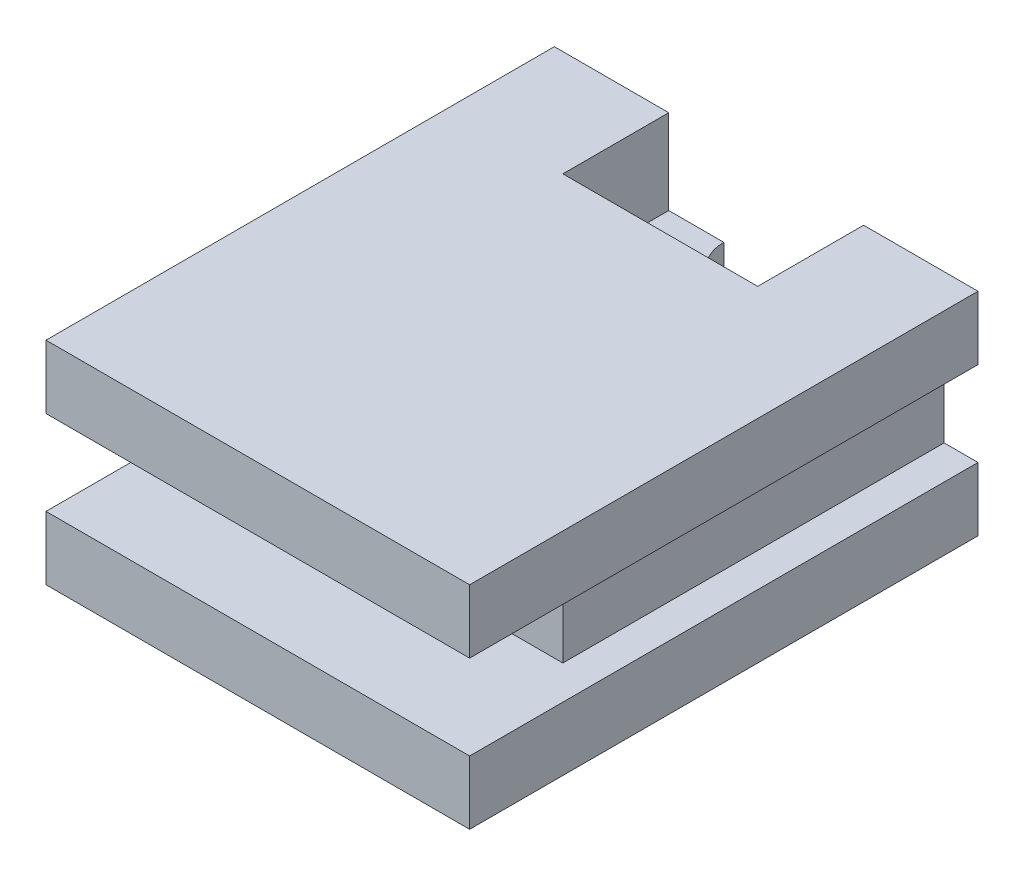
ISO-10303-21;
HEADER;
FILE_DESCRIPTION(('STEP AP214'),'2;1');
FILE_NAME('part.step','',(''),(''),'','','');
FILE_SCHEMA(('AUTOMOTIVE_DESIGN { 1 0 10303 214 1 1 1 1 }'));
ENDSEC;
DATA;
#1=APPLICATION_CONTEXT('core data for automotive mechanical design processes');
#2=APPLICATION_PROTOCOL_DEFINITION('international standard','automotive_design',2000,#1);
#3=PRODUCT_CONTEXT('',#1,'mechanical');
#4=PRODUCT('Part','Part','',(#3));
#5=PRODUCT_RELATED_PRODUCT_CATEGORY('part','',(#4));
#6=PRODUCT_DEFINITION_FORMATION('','',#4);
#7=PRODUCT_DEFINITION_CONTEXT('part definition',#1,'design');
#8=PRODUCT_DEFINITION('design','',#6,#7);
#9=PRODUCT_DEFINITION_SHAPE('','',#8);
#10=(LENGTH_UNIT() NAMED_UNIT(*) SI_UNIT(.MILLI.,.METRE.));
#11=(NAMED_UNIT(*) PLANE_ANGLE_UNIT() SI_UNIT($,.RADIAN.));
#12=(NAMED_UNIT(*) SI_UNIT($,.STERADIAN.) SOLID_ANGLE_UNIT());
#13=UNCERTAINTY_MEASURE_WITH_UNIT(LENGTH_MEASURE(1.E-05),#10,'distance_accuracy_value','');
#14=(GEOMETRIC_REPRESENTATION_CONTEXT(3) GLOBAL_UNCERTAINTY_ASSIGNED_CONTEXT((#13)) GLOBAL_UNIT_ASSIGNED_CONTEXT((#10,
#11,#12)) REPRESENTATION_CONTEXT('',''));
#15=CARTESIAN_POINT('',(0.,0.,0.));
#16=DIRECTION('',(0.,0.,1.));
#17=DIRECTION('',(1.,0.,0.));
#18=AXIS2_PLACEMENT_3D('',#15,#16,#17);
#19=CARTESIAN_POINT('',(0.,0.,0.));
#20=DIRECTION('',(0.,0.,1.));
#21=DIRECTION('',(1.,0.,0.));
#22=AXIS2_PLACEMENT_3D('',#19,#20,#21);
#23=PLANE('',#22);
#24=DIRECTION('',(1.,0.,0.));
#25=VECTOR('',#24,1.);
#26=CARTESIAN_POINT('',(0.,2.5,0.));
#27=LINE('',#26,#25);
#28=CARTESIAN_POINT('',(5.,2.5,0.));
#29=VERTEX_POINT('',#28);
#30=CARTESIAN_POINT('',(11.5,2.5,0.));
#31=VERTEX_POINT('',#30);
#32=EDGE_CURVE('E49',#29,#31,#27,.T.);
#33=ORIENTED_EDGE('',*,*,#32,.T.);
#34=DIRECTION('',(0.,1.,0.));
#35=VECTOR('',#34,1.);
#36=CARTESIAN_POINT('',(11.5,0.,0.));
#37=LINE('',#36,#35);
#38=CARTESIAN_POINT('',(11.5,12.5,0.));
#39=VERTEX_POINT('',#38);
#40=EDGE_CURVE('E193',#31,#39,#37,.T.);
#41=ORIENTED_EDGE('',*,*,#40,.T.);
#42=DIRECTION('',(1.,0.,0.));
#43=VECTOR('',#42,1.);
#44=CARTESIAN_POINT('',(0.,12.5,0.));
#45=LINE('',#44,#43);
#46=CARTESIAN_POINT('',(25.,12.5,0.));
#47=VERTEX_POINT('',#46);
#48=EDGE_CURVE('E260',#39,#47,#45,.T.);
#49=ORIENTED_EDGE('',*,*,#48,.T.);
#50=DIRECTION('',(0.,1.,0.));
#51=VECTOR('',#50,1.);
#52=CARTESIAN_POINT('',(25.,0.,0.));
#53=LINE('',#52,#51);
#54=CARTESIAN_POINT('',(25.,5.,0.));
#55=VERTEX_POINT('',#54);
#56=EDGE_CURVE('E248',#55,#47,#53,.T.);
#57=ORIENTED_EDGE('',*,*,#56,.F.);
#58=DIRECTION('',(1.,0.,0.));
#59=VECTOR('',#58,1.);
#60=CARTESIAN_POINT('',(0.,5.00000000000002,0.));
#61=LINE('',#60,#59);
#62=CARTESIAN_POINT('',(21.,5.,0.));
#63=VERTEX_POINT('',#62);
#64=EDGE_CURVE('E254',#63,#55,#61,.T.);
#65=ORIENTED_EDGE('',*,*,#64,.F.);
#66=DIRECTION('',(0.,1.,0.));
#67=VECTOR('',#66,1.);
#68=CARTESIAN_POINT('',(21.,0.,0.));
#69=LINE('',#68,#67);
#70=CARTESIAN_POINT('',(21.,-5.,0.));
#71=VERTEX_POINT('',#70);
#72=EDGE_CURVE('E251',#71,#63,#69,.T.);
#73=ORIENTED_EDGE('',*,*,#72,.F.);
#74=DIRECTION('',(1.,0.,0.));
#75=VECTOR('',#74,1.);
#76=CARTESIAN_POINT('',(0.,-4.99999999999998,0.));
#77=LINE('',#76,#75);
#78=CARTESIAN_POINT('',(25.,-5.,0.));
#79=VERTEX_POINT('',#78);
#80=EDGE_CURVE('E247',#71,#79,#77,.T.);
#81=ORIENTED_EDGE('',*,*,#80,.T.);
#82=CARTESIAN_POINT('',(25.,-12.5,0.));
#83=VERTEX_POINT('',#82);
#84=EDGE_CURVE('E244',#83,#79,#53,.T.);
#85=ORIENTED_EDGE('',*,*,#84,.F.);
#86=DIRECTION('',(1.,0.,0.));
#87=VECTOR('',#86,1.);
#88=CARTESIAN_POINT('',(0.,-12.5,0.));
#89=LINE('',#88,#87);
#90=CARTESIAN_POINT('',(5.,-12.5,0.));
#91=VERTEX_POINT('',#90);
#92=EDGE_CURVE('E240',#91,#83,#89,.T.);
#93=ORIENTED_EDGE('',*,*,#92,.F.);
#94=DIRECTION('',(0.,1.,0.));
#95=VECTOR('',#94,1.);
#96=CARTESIAN_POINT('',(5.,-12.5,0.));
#97=LINE('',#96,#95);
#98=EDGE_CURVE('E288',#91,#29,#97,.T.);
#99=ORIENTED_EDGE('',*,*,#98,.T.);
#100=EDGE_LOOP('',(#33,#41,#49,#57,#65,#73,#81,#85,#93,#99));
#101=FACE_BOUND('',#100,.T.);
#102=ADVANCED_FACE('F34',(#101),#23,.F.);
#103=CARTESIAN_POINT('',(0.,0.,60.));
#104=DIRECTION('',(0.,0.,1.));
#105=DIRECTION('',(1.,0.,0.));
#106=AXIS2_PLACEMENT_3D('',#103,#104,#105);
#107=PLANE('',#106);
#108=DIRECTION('',(0.,1.,0.));
#109=VECTOR('',#108,1.);
#110=CARTESIAN_POINT('',(25.,0.,60.));
#111=LINE('',#110,#109);
#112=CARTESIAN_POINT('',(25.,-12.5,60.));
#113=VERTEX_POINT('',#112);
#114=CARTESIAN_POINT('',(25.,-5.,60.));
#115=VERTEX_POINT('',#114);
#116=EDGE_CURVE('E222',#113,#115,#111,.T.);
#117=ORIENTED_EDGE('',*,*,#116,.T.);
#118=DIRECTION('',(-1.,0.,0.));
#119=VECTOR('',#118,1.);
#120=CARTESIAN_POINT('',(0.,-4.99999999999999,60.));
#121=LINE('',#120,#119);
#122=CARTESIAN_POINT('',(-25.,-5.,60.));
#123=VERTEX_POINT('',#122);
#124=EDGE_CURVE('E213',#115,#123,#121,.T.);
#125=ORIENTED_EDGE('',*,*,#124,.T.);
#126=DIRECTION('',(0.,1.,0.));
#127=VECTOR('',#126,1.);
#128=CARTESIAN_POINT('',(-25.,0.,60.));
#129=LINE('',#128,#127);
#130=CARTESIAN_POINT('',(-25.,-12.5,60.));
#131=VERTEX_POINT('',#130);
#132=EDGE_CURVE('E216',#131,#123,#129,.T.);
#133=ORIENTED_EDGE('',*,*,#132,.F.);
#134=DIRECTION('',(1.,0.,0.));
#135=VECTOR('',#134,1.);
#136=CARTESIAN_POINT('',(0.,-12.5,60.));
#137=LINE('',#136,#135);
#138=EDGE_CURVE('E219',#131,#113,#137,.T.);
#139=ORIENTED_EDGE('',*,*,#138,.T.);
#140=EDGE_LOOP('',(#117,#125,#133,#139));
#141=FACE_BOUND('',#140,.T.);
#142=ADVANCED_FACE('F304',(#141),#107,.T.);
#143=CARTESIAN_POINT('',(-21.,0.,60.));
#144=DIRECTION('',(-1.,0.,0.));
#145=DIRECTION('',(0.,-1.,0.));
#146=AXIS2_PLACEMENT_3D('',#143,#144,#145);
#147=PLANE('',#146);
#148=DIRECTION('',(0.,-1.,0.));
#149=VECTOR('',#148,1.);
#150=CARTESIAN_POINT('',(-21.,-4.99999999999999,45.));
#151=LINE('',#150,#149);
#152=CARTESIAN_POINT('',(-21.,5.,45.));
#153=VERTEX_POINT('',#152);
#154=CARTESIAN_POINT('',(-21.,-4.99999999999999,45.));
#155=VERTEX_POINT('',#154);
#156=EDGE_CURVE('E199',#153,#155,#151,.T.);
#157=ORIENTED_EDGE('',*,*,#156,.F.);
#158=DIRECTION('',(0.,0.,-1.));
#159=VECTOR('',#158,1.);
#160=CARTESIAN_POINT('',(-21.,5.,60.));
#161=LINE('',#160,#159);
#162=CARTESIAN_POINT('',(-21.,5.,0.));
#163=VERTEX_POINT('',#162);
#164=EDGE_CURVE('E285',#153,#163,#161,.T.);
#165=ORIENTED_EDGE('',*,*,#164,.T.);
#166=DIRECTION('',(0.,1.,0.));
#167=VECTOR('',#166,1.);
#168=CARTESIAN_POINT('',(-21.,0.,0.));
#169=LINE('',#168,#167);
#170=CARTESIAN_POINT('',(-21.,-5.,0.));
#171=VERTEX_POINT('',#170);
#172=EDGE_CURVE('E231',#171,#163,#169,.T.);
#173=ORIENTED_EDGE('',*,*,#172,.F.);
#174=DIRECTION('',(0.,0.,-1.));
#175=VECTOR('',#174,1.);
#176=CARTESIAN_POINT('',(-21.,-5.,60.));
#177=LINE('',#176,#175);
#178=EDGE_CURVE('E283',#155,#171,#177,.T.);
#179=ORIENTED_EDGE('',*,*,#178,.F.);
#180=EDGE_LOOP('',(#157,#165,#173,#179));
#181=FACE_BOUND('',#180,.T.);
#182=ADVANCED_FACE('F36',(#181),#147,.T.);
#183=CARTESIAN_POINT('',(-25.,0.,60.));
#184=DIRECTION('',(-1.,0.,0.));
#185=DIRECTION('',(0.,0.,1.));
#186=AXIS2_PLACEMENT_3D('',#183,#184,#185);
#187=PLANE('',#186);
#188=DIRECTION('',(0.,1.,0.));
#189=VECTOR('',#188,1.);
#190=CARTESIAN_POINT('',(-25.,0.,0.));
#191=LINE('',#190,#189);
#192=CARTESIAN_POINT('',(-25.,-12.5,0.));
#193=VERTEX_POINT('',#192);
#194=CARTESIAN_POINT('',(-25.,-5.,0.));
#195=VERTEX_POINT('',#194);
#196=EDGE_CURVE('E237',#193,#195,#191,.T.);
#197=ORIENTED_EDGE('',*,*,#196,.F.);
#198=DIRECTION('',(0.,0.,-1.));
#199=VECTOR('',#198,1.);
#200=CARTESIAN_POINT('',(-25.,-12.5,60.));
#201=LINE('',#200,#199);
#202=EDGE_CURVE('E279',#131,#193,#201,.T.);
#203=ORIENTED_EDGE('',*,*,#202,.F.);
#204=ORIENTED_EDGE('',*,*,#132,.T.);
#205=DIRECTION('',(0.,0.,-1.));
#206=VECTOR('',#205,1.);
#207=CARTESIAN_POINT('',(-25.,-5.,60.));
#208=LINE('',#207,#206);
#209=EDGE_CURVE('E281',#123,#195,#208,.T.);
#210=ORIENTED_EDGE('',*,*,#209,.T.);
#211=EDGE_LOOP('',(#197,#203,#204,#210));
#212=FACE_BOUND('',#211,.T.);
#213=ADVANCED_FACE('F311',(#212),#187,.T.);
#214=CARTESIAN_POINT('',(0.,-12.5,60.));
#215=DIRECTION('',(0.,1.,0.));
#216=DIRECTION('',(0.,0.,1.));
#217=AXIS2_PLACEMENT_3D('',#214,#215,#216);
#218=PLANE('',#217);
#219=CARTESIAN_POINT('',(-5.,-12.5,0.));
#220=VERTEX_POINT('',#219);
#221=EDGE_CURVE('E241',#193,#220,#89,.T.);
#222=ORIENTED_EDGE('',*,*,#221,.T.);
#223=CARTESIAN_POINT('',(0.,-12.5,0.));
#224=DIRECTION('',(0.,1.,0.));
#225=DIRECTION('',(0.,0.,1.));
#226=AXIS2_PLACEMENT_3D('',#223,#224,#225);
#227=CIRCLE('',#226,5.);
#228=EDGE_CURVE('E196',#220,#91,#227,.T.);
#229=ORIENTED_EDGE('',*,*,#228,.T.);
#230=ORIENTED_EDGE('',*,*,#92,.T.);
#231=DIRECTION('',(0.,0.,-1.));
#232=VECTOR('',#231,1.);
#233=CARTESIAN_POINT('',(25.,-12.5,60.));
#234=LINE('',#233,#232);
#235=EDGE_CURVE('E276',#113,#83,#234,.T.);
#236=ORIENTED_EDGE('',*,*,#235,.F.);
#237=ORIENTED_EDGE('',*,*,#138,.F.);
#238=ORIENTED_EDGE('',*,*,#202,.T.);
#239=EDGE_LOOP('',(#222,#229,#230,#236,#237,#238));
#240=FACE_BOUND('',#239,.T.);
#241=ADVANCED_FACE('F297',(#240),#218,.F.);
#242=CARTESIAN_POINT('',(25.,0.,60.));
#243=DIRECTION('',(-1.,0.,0.));
#244=DIRECTION('',(0.,0.,1.));
#245=AXIS2_PLACEMENT_3D('',#242,#243,#244);
#246=PLANE('',#245);
#247=ORIENTED_EDGE('',*,*,#84,.T.);
#248=DIRECTION('',(0.,0.,-1.));
#249=VECTOR('',#248,1.);
#250=CARTESIAN_POINT('',(25.,-5.,60.));
#251=LINE('',#250,#249);
#252=EDGE_CURVE('E274',#115,#79,#251,.T.);
#253=ORIENTED_EDGE('',*,*,#252,.F.);
#254=ORIENTED_EDGE('',*,*,#116,.F.);
#255=ORIENTED_EDGE('',*,*,#235,.T.);
#256=EDGE_LOOP('',(#247,#253,#254,#255));
#257=FACE_BOUND('',#256,.T.);
#258=ADVANCED_FACE('F301',(#257),#246,.F.);
#259=CARTESIAN_POINT('',(0.,-4.99999999999998,60.));
#260=DIRECTION('',(0.,1.,0.));
#261=DIRECTION('',(-1.,0.,0.));
#262=AXIS2_PLACEMENT_3D('',#259,#260,#261);
#263=PLANE('',#262);
#264=DIRECTION('',(0.,0.,-1.));
#265=VECTOR('',#264,1.);
#266=CARTESIAN_POINT('',(21.,-5.,60.));
#267=LINE('',#266,#265);
#268=CARTESIAN_POINT('',(21.,-4.99999999999999,45.));
#269=VERTEX_POINT('',#268);
#270=EDGE_CURVE('E272',#269,#71,#267,.T.);
#271=ORIENTED_EDGE('',*,*,#270,.F.);
#272=DIRECTION('',(-1.,0.,0.));
#273=VECTOR('',#272,1.);
#274=CARTESIAN_POINT('',(25.,-4.99999999999999,45.));
#275=LINE('',#274,#273);
#276=EDGE_CURVE('E203',#269,#155,#275,.T.);
#277=ORIENTED_EDGE('',*,*,#276,.T.);
#278=ORIENTED_EDGE('',*,*,#178,.T.);
#279=DIRECTION('',(-1.,0.,0.));
#280=VECTOR('',#279,1.);
#281=CARTESIAN_POINT('',(0.,-4.99999999999999,0.));
#282=LINE('',#281,#280);
#283=EDGE_CURVE('E234',#171,#195,#282,.T.);
#284=ORIENTED_EDGE('',*,*,#283,.T.);
#285=ORIENTED_EDGE('',*,*,#209,.F.);
#286=ORIENTED_EDGE('',*,*,#124,.F.);
#287=ORIENTED_EDGE('',*,*,#252,.T.);
#288=ORIENTED_EDGE('',*,*,#80,.F.);
#289=EDGE_LOOP('',(#271,#277,#278,#284,#285,#286,#287,#288));
#290=FACE_BOUND('',#289,.T.);
#291=ADVANCED_FACE('F314',(#290),#263,.T.);
#292=CARTESIAN_POINT('',(21.,0.,60.));
#293=DIRECTION('',(-1.,0.,0.));
#294=DIRECTION('',(0.,0.,1.));
#295=AXIS2_PLACEMENT_3D('',#292,#293,#294);
#296=PLANE('',#295);
#297=DIRECTION('',(0.,0.,-1.));
#298=VECTOR('',#297,1.);
#299=CARTESIAN_POINT('',(21.,5.,60.));
#300=LINE('',#299,#298);
#301=CARTESIAN_POINT('',(21.,5.,45.));
#302=VERTEX_POINT('',#301);
#303=EDGE_CURVE('E270',#302,#63,#300,.T.);
#304=ORIENTED_EDGE('',*,*,#303,.F.);
#305=DIRECTION('',(0.,-1.,0.));
#306=VECTOR('',#305,1.);
#307=CARTESIAN_POINT('',(21.,0.,45.));
#308=LINE('',#307,#306);
#309=EDGE_CURVE('E205',#302,#269,#308,.T.);
#310=ORIENTED_EDGE('',*,*,#309,.T.);
#311=ORIENTED_EDGE('',*,*,#270,.T.);
#312=ORIENTED_EDGE('',*,*,#72,.T.);
#313=EDGE_LOOP('',(#304,#310,#311,#312));
#314=FACE_BOUND('',#313,.T.);
#315=ADVANCED_FACE('F350',(#314),#296,.F.);
#316=CARTESIAN_POINT('',(0.,5.00000000000002,60.));
#317=DIRECTION('',(0.,1.,0.));
#318=DIRECTION('',(-1.,0.,0.));
#319=AXIS2_PLACEMENT_3D('',#316,#317,#318);
#320=PLANE('',#319);
#321=ORIENTED_EDGE('',*,*,#64,.T.);
#322=DIRECTION('',(0.,0.,-1.));
#323=VECTOR('',#322,1.);
#324=CARTESIAN_POINT('',(25.,5.,60.));
#325=LINE('',#324,#323);
#326=CARTESIAN_POINT('',(25.,5.,60.));
#327=VERTEX_POINT('',#326);
#328=EDGE_CURVE('E268',#327,#55,#325,.T.);
#329=ORIENTED_EDGE('',*,*,#328,.F.);
#330=DIRECTION('',(-1.,0.,0.));
#331=VECTOR('',#330,1.);
#332=CARTESIAN_POINT('',(0.,5.,60.));
#333=LINE('',#332,#331);
#334=CARTESIAN_POINT('',(-25.,5.,60.));
#335=VERTEX_POINT('',#334);
#336=EDGE_CURVE('E210',#327,#335,#333,.T.);
#337=ORIENTED_EDGE('',*,*,#336,.T.);
#338=DIRECTION('',(0.,0.,-1.));
#339=VECTOR('',#338,1.);
#340=CARTESIAN_POINT('',(-25.,5.,60.));
#341=LINE('',#340,#339);
#342=CARTESIAN_POINT('',(-25.,5.,0.));
#343=VERTEX_POINT('',#342);
#344=EDGE_CURVE('E261',#335,#343,#341,.T.);
#345=ORIENTED_EDGE('',*,*,#344,.T.);
#346=DIRECTION('',(-1.,0.,0.));
#347=VECTOR('',#346,1.);
#348=CARTESIAN_POINT('',(0.,5.,0.));
#349=LINE('',#348,#347);
#350=EDGE_CURVE('E209',#163,#343,#349,.T.);
#351=ORIENTED_EDGE('',*,*,#350,.F.);
#352=ORIENTED_EDGE('',*,*,#164,.F.);
#353=DIRECTION('',(-1.,0.,0.));
#354=VECTOR('',#353,1.);
#355=CARTESIAN_POINT('',(25.,5.,45.));
#356=LINE('',#355,#354);
#357=EDGE_CURVE('E202',#302,#153,#356,.T.);
#358=ORIENTED_EDGE('',*,*,#357,.F.);
#359=ORIENTED_EDGE('',*,*,#303,.T.);
#360=EDGE_LOOP('',(#321,#329,#337,#345,#351,#352,#358,#359));
#361=FACE_BOUND('',#360,.T.);
#362=ADVANCED_FACE('F323',(#361),#320,.F.);
#363=ORIENTED_EDGE('',*,*,#56,.T.);
#364=DIRECTION('',(0.,0.,-1.));
#365=VECTOR('',#364,1.);
#366=CARTESIAN_POINT('',(25.,12.5,60.));
#367=LINE('',#366,#365);
#368=CARTESIAN_POINT('',(25.,12.5,60.));
#369=VERTEX_POINT('',#368);
#370=EDGE_CURVE('E265',#369,#47,#367,.T.);
#371=ORIENTED_EDGE('',*,*,#370,.F.);
#372=EDGE_CURVE('E225',#327,#369,#111,.T.);
#373=ORIENTED_EDGE('',*,*,#372,.F.);
#374=ORIENTED_EDGE('',*,*,#328,.T.);
#375=EDGE_LOOP('',(#363,#371,#373,#374));
#376=FACE_BOUND('',#375,.T.);
#377=ADVANCED_FACE('F344',(#376),#246,.F.);
#378=CARTESIAN_POINT('',(0.,12.5,60.));
#379=DIRECTION('',(0.,1.,0.));
#380=DIRECTION('',(0.,0.,1.));
#381=AXIS2_PLACEMENT_3D('',#378,#379,#380);
#382=PLANE('',#381);
#383=DIRECTION('',(0.,0.,-1.));
#384=VECTOR('',#383,1.);
#385=CARTESIAN_POINT('',(11.5,12.5,12.5));
#386=LINE('',#385,#384);
#387=CARTESIAN_POINT('',(11.5,12.5,12.5));
#388=VERTEX_POINT('',#387);
#389=EDGE_CURVE('E185',#388,#39,#386,.T.);
#390=ORIENTED_EDGE('',*,*,#389,.F.);
#391=DIRECTION('',(1.,0.,0.));
#392=VECTOR('',#391,1.);
#393=CARTESIAN_POINT('',(-11.5,12.5,12.5));
#394=LINE('',#393,#392);
#395=CARTESIAN_POINT('',(-11.5,12.5,12.5));
#396=VERTEX_POINT('',#395);
#397=EDGE_CURVE('E188',#396,#388,#394,.T.);
#398=ORIENTED_EDGE('',*,*,#397,.F.);
#399=DIRECTION('',(0.,0.,1.));
#400=VECTOR('',#399,1.);
#401=CARTESIAN_POINT('',(-11.5,12.5,12.5));
#402=LINE('',#401,#400);
#403=CARTESIAN_POINT('',(-11.5,12.5,0.));
#404=VERTEX_POINT('',#403);
#405=EDGE_CURVE('E174',#404,#396,#402,.T.);
#406=ORIENTED_EDGE('',*,*,#405,.F.);
#407=CARTESIAN_POINT('',(-25.,12.5,0.));
#408=VERTEX_POINT('',#407);
#409=EDGE_CURVE('E257',#408,#404,#45,.T.);
#410=ORIENTED_EDGE('',*,*,#409,.F.);
#411=DIRECTION('',(0.,0.,-1.));
#412=VECTOR('',#411,1.);
#413=CARTESIAN_POINT('',(-25.,12.5,60.));
#414=LINE('',#413,#412);
#415=CARTESIAN_POINT('',(-25.,12.5,60.));
#416=VERTEX_POINT('',#415);
#417=EDGE_CURVE('E263',#416,#408,#414,.T.);
#418=ORIENTED_EDGE('',*,*,#417,.F.);
#419=DIRECTION('',(1.,0.,0.));
#420=VECTOR('',#419,1.);
#421=CARTESIAN_POINT('',(0.,12.5,60.));
#422=LINE('',#421,#420);
#423=EDGE_CURVE('E226',#416,#369,#422,.T.);
#424=ORIENTED_EDGE('',*,*,#423,.T.);
#425=ORIENTED_EDGE('',*,*,#370,.T.);
#426=ORIENTED_EDGE('',*,*,#48,.F.);
#427=EDGE_LOOP('',(#390,#398,#406,#410,#418,#424,#425,#426));
#428=FACE_BOUND('',#427,.T.);
#429=ADVANCED_FACE('F334',(#428),#382,.T.);
#430=EDGE_CURVE('E214',#343,#408,#191,.T.);
#431=ORIENTED_EDGE('',*,*,#430,.F.);
#432=ORIENTED_EDGE('',*,*,#344,.F.);
#433=EDGE_CURVE('E220',#335,#416,#129,.T.);
#434=ORIENTED_EDGE('',*,*,#433,.T.);
#435=ORIENTED_EDGE('',*,*,#417,.T.);
#436=EDGE_LOOP('',(#431,#432,#434,#435));
#437=FACE_BOUND('',#436,.T.);
#438=ADVANCED_FACE('F327',(#437),#187,.T.);
#439=ORIENTED_EDGE('',*,*,#336,.F.);
#440=ORIENTED_EDGE('',*,*,#372,.T.);
#441=ORIENTED_EDGE('',*,*,#423,.F.);
#442=ORIENTED_EDGE('',*,*,#433,.F.);
#443=EDGE_LOOP('',(#439,#440,#441,#442));
#444=FACE_BOUND('',#443,.T.);
#445=ADVANCED_FACE('F360',(#444),#107,.T.);
#446=ORIENTED_EDGE('',*,*,#409,.T.);
#447=DIRECTION('',(0.,-1.,0.));
#448=VECTOR('',#447,1.);
#449=CARTESIAN_POINT('',(-11.5,0.,0.));
#450=LINE('',#449,#448);
#451=CARTESIAN_POINT('',(-11.5,2.5,0.));
#452=VERTEX_POINT('',#451);
#453=EDGE_CURVE('E11',#404,#452,#450,.T.);
#454=ORIENTED_EDGE('',*,*,#453,.T.);
#455=DIRECTION('',(1.,0.,0.));
#456=VECTOR('',#455,1.);
#457=CARTESIAN_POINT('',(0.,2.5,0.));
#458=LINE('',#457,#456);
#459=CARTESIAN_POINT('',(-5.,2.5,0.));
#460=VERTEX_POINT('',#459);
#461=EDGE_CURVE('E166',#452,#460,#458,.T.);
#462=ORIENTED_EDGE('',*,*,#461,.T.);
#463=DIRECTION('',(0.,1.,0.));
#464=VECTOR('',#463,1.);
#465=CARTESIAN_POINT('',(-5.,-12.5,0.));
#466=LINE('',#465,#464);
#467=EDGE_CURVE('E57',#460,#220,#466,.F.);
#468=ORIENTED_EDGE('',*,*,#467,.T.);
#469=ORIENTED_EDGE('',*,*,#221,.F.);
#470=ORIENTED_EDGE('',*,*,#196,.T.);
#471=ORIENTED_EDGE('',*,*,#283,.F.);
#472=ORIENTED_EDGE('',*,*,#172,.T.);
#473=ORIENTED_EDGE('',*,*,#350,.T.);
#474=ORIENTED_EDGE('',*,*,#430,.T.);
#475=EDGE_LOOP('',(#446,#454,#462,#468,#469,#470,#471,#472,#473,#474));
#476=FACE_BOUND('',#475,.T.);
#477=ADVANCED_FACE('F309',(#476),#23,.F.);
#478=CARTESIAN_POINT('',(25.,-4.99999999999999,45.));
#479=DIRECTION('',(0.,0.,-1.));
#480=DIRECTION('',(-1.,0.,0.));
#481=AXIS2_PLACEMENT_3D('',#478,#479,#480);
#482=PLANE('',#481);
#483=ORIENTED_EDGE('',*,*,#357,.T.);
#484=ORIENTED_EDGE('',*,*,#156,.T.);
#485=ORIENTED_EDGE('',*,*,#276,.F.);
#486=ORIENTED_EDGE('',*,*,#309,.F.);
#487=EDGE_LOOP('',(#483,#484,#485,#486));
#488=FACE_BOUND('',#487,.T.);
#489=ADVANCED_FACE('F352',(#488),#482,.F.);
#490=CARTESIAN_POINT('',(0.,-12.5,0.));
#491=DIRECTION('',(0.,1.,0.));
#492=DIRECTION('',(0.,0.,1.));
#493=AXIS2_PLACEMENT_3D('',#490,#491,#492);
#494=CYLINDRICAL_SURFACE('',#493,5.);
#495=ORIENTED_EDGE('',*,*,#467,.F.);
#496=CARTESIAN_POINT('',(0.,2.5,0.));
#497=DIRECTION('',(0.,-1.,0.));
#498=DIRECTION('',(0.,0.,-1.));
#499=AXIS2_PLACEMENT_3D('',#496,#497,#498);
#500=CIRCLE('',#499,5.);
#501=EDGE_CURVE('E42',#460,#29,#500,.F.);
#502=ORIENTED_EDGE('',*,*,#501,.T.);
#503=ORIENTED_EDGE('',*,*,#98,.F.);
#504=ORIENTED_EDGE('',*,*,#228,.F.);
#505=EDGE_LOOP('',(#495,#502,#503,#504));
#506=FACE_BOUND('',#505,.T.);
#507=ADVANCED_FACE('F291',(#506),#494,.F.);
#508=CARTESIAN_POINT('',(11.5,2.5,12.5));
#509=DIRECTION('',(1.,0.,0.));
#510=DIRECTION('',(0.,0.,-1.));
#511=AXIS2_PLACEMENT_3D('',#508,#509,#510);
#512=PLANE('',#511);
#513=DIRECTION('',(0.,0.,-1.));
#514=VECTOR('',#513,1.);
#515=CARTESIAN_POINT('',(11.5,2.5,12.5));
#516=LINE('',#515,#514);
#517=CARTESIAN_POINT('',(11.5,2.5,12.5));
#518=VERTEX_POINT('',#517);
#519=EDGE_CURVE('E168',#518,#31,#516,.T.);
#520=ORIENTED_EDGE('',*,*,#519,.F.);
#521=DIRECTION('',(0.,1.,0.));
#522=VECTOR('',#521,1.);
#523=CARTESIAN_POINT('',(11.5,2.5,12.5));
#524=LINE('',#523,#522);
#525=EDGE_CURVE('E178',#518,#388,#524,.T.);
#526=ORIENTED_EDGE('',*,*,#525,.T.);
#527=ORIENTED_EDGE('',*,*,#389,.T.);
#528=ORIENTED_EDGE('',*,*,#40,.F.);
#529=EDGE_LOOP('',(#520,#526,#527,#528));
#530=FACE_BOUND('',#529,.T.);
#531=ADVANCED_FACE('F337',(#530),#512,.F.);
#532=CARTESIAN_POINT('',(-11.5,2.5,12.5));
#533=DIRECTION('',(-1.,0.,0.));
#534=DIRECTION('',(0.,0.,1.));
#535=AXIS2_PLACEMENT_3D('',#532,#533,#534);
#536=PLANE('',#535);
#537=ORIENTED_EDGE('',*,*,#405,.T.);
#538=DIRECTION('',(0.,1.,0.));
#539=VECTOR('',#538,1.);
#540=CARTESIAN_POINT('',(-11.5,2.5,12.5));
#541=LINE('',#540,#539);
#542=CARTESIAN_POINT('',(-11.5,2.5,12.5));
#543=VERTEX_POINT('',#542);
#544=EDGE_CURVE('E171',#543,#396,#541,.T.);
#545=ORIENTED_EDGE('',*,*,#544,.F.);
#546=DIRECTION('',(0.,0.,1.));
#547=VECTOR('',#546,1.);
#548=CARTESIAN_POINT('',(-11.5,2.5,12.5));
#549=LINE('',#548,#547);
#550=EDGE_CURVE('E161',#452,#543,#549,.T.);
#551=ORIENTED_EDGE('',*,*,#550,.F.);
#552=ORIENTED_EDGE('',*,*,#453,.F.);
#553=EDGE_LOOP('',(#537,#545,#551,#552));
#554=FACE_BOUND('',#553,.T.);
#555=ADVANCED_FACE('F172',(#554),#536,.F.);
#556=CARTESIAN_POINT('',(0.,2.5,0.));
#557=DIRECTION('',(0.,-1.,0.));
#558=DIRECTION('',(0.,0.,-1.));
#559=AXIS2_PLACEMENT_3D('',#556,#557,#558);
#560=PLANE('',#559);
#561=ORIENTED_EDGE('',*,*,#501,.F.);
#562=ORIENTED_EDGE('',*,*,#461,.F.);
#563=ORIENTED_EDGE('',*,*,#550,.T.);
#564=DIRECTION('',(1.,0.,0.));
#565=VECTOR('',#564,1.);
#566=CARTESIAN_POINT('',(-11.5,2.5,12.5));
#567=LINE('',#566,#565);
#568=EDGE_CURVE('E165',#543,#518,#567,.T.);
#569=ORIENTED_EDGE('',*,*,#568,.T.);
#570=ORIENTED_EDGE('',*,*,#519,.T.);
#571=ORIENTED_EDGE('',*,*,#32,.F.);
#572=EDGE_LOOP('',(#561,#562,#563,#569,#570,#571));
#573=FACE_BOUND('',#572,.T.);
#574=ADVANCED_FACE('F163',(#573),#560,.F.);
#575=CARTESIAN_POINT('',(-11.5,2.5,12.5));
#576=DIRECTION('',(0.,0.,1.));
#577=DIRECTION('',(1.,0.,0.));
#578=AXIS2_PLACEMENT_3D('',#575,#576,#577);
#579=PLANE('',#578);
#580=ORIENTED_EDGE('',*,*,#397,.T.);
#581=ORIENTED_EDGE('',*,*,#525,.F.);
#582=ORIENTED_EDGE('',*,*,#568,.F.);
#583=ORIENTED_EDGE('',*,*,#544,.T.);
#584=EDGE_LOOP('',(#580,#581,#582,#583));
#585=FACE_BOUND('',#584,.T.);
#586=ADVANCED_FACE('F180',(#585),#579,.F.);
#587=CLOSED_SHELL('',(#102,#142,#182,#213,#241,#258,#291,#315,#362,#377,#429,#438,#445,#477,
#489,#507,#531,#555,#574,#586));
#588=MANIFOLD_SOLID_BREP('B2',#587);
#589=ADVANCED_BREP_SHAPE_REPRESENTATION('',(#18,#588),#14);
#590=SHAPE_DEFINITION_REPRESENTATION(#9,#589);
ENDSEC;
END-ISO-10303-21;
